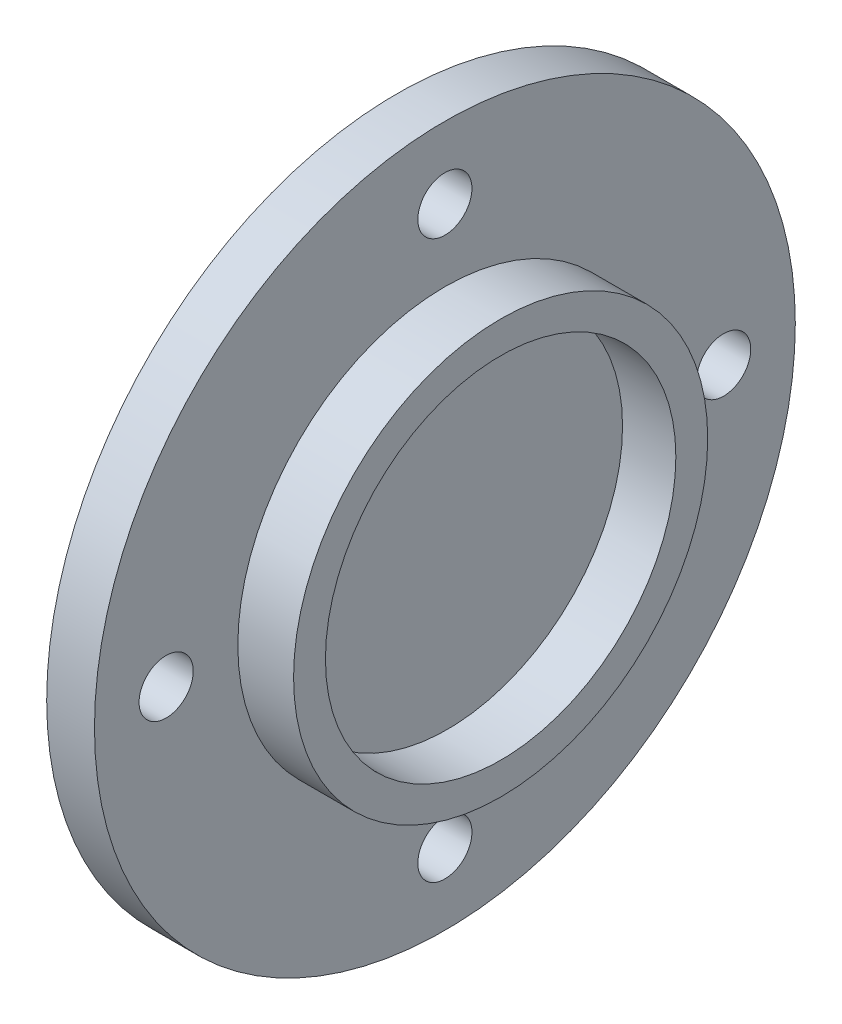
ISO-10303-21;
HEADER;
FILE_DESCRIPTION(('STEP AP214'),'2;1');
FILE_NAME('part.step','',(''),(''),'','','');
FILE_SCHEMA(('AUTOMOTIVE_DESIGN { 1 0 10303 214 1 1 1 1 }'));
ENDSEC;
DATA;
#1=APPLICATION_CONTEXT('core data for automotive mechanical design processes');
#2=APPLICATION_PROTOCOL_DEFINITION('international standard','automotive_design',2000,#1);
#3=PRODUCT_CONTEXT('',#1,'mechanical');
#4=PRODUCT('Part','Part','',(#3));
#5=PRODUCT_RELATED_PRODUCT_CATEGORY('part','',(#4));
#6=PRODUCT_DEFINITION_FORMATION('','',#4);
#7=PRODUCT_DEFINITION_CONTEXT('part definition',#1,'design');
#8=PRODUCT_DEFINITION('design','',#6,#7);
#9=PRODUCT_DEFINITION_SHAPE('','',#8);
#10=(LENGTH_UNIT() NAMED_UNIT(*) SI_UNIT(.MILLI.,.METRE.));
#11=(NAMED_UNIT(*) PLANE_ANGLE_UNIT() SI_UNIT($,.RADIAN.));
#12=(NAMED_UNIT(*) SI_UNIT($,.STERADIAN.) SOLID_ANGLE_UNIT());
#13=UNCERTAINTY_MEASURE_WITH_UNIT(LENGTH_MEASURE(1.E-05),#10,'distance_accuracy_value','');
#14=(GEOMETRIC_REPRESENTATION_CONTEXT(3) GLOBAL_UNCERTAINTY_ASSIGNED_CONTEXT((#13)) GLOBAL_UNIT_ASSIGNED_CONTEXT((#10,
#11,#12)) REPRESENTATION_CONTEXT('',''));
#15=CARTESIAN_POINT('',(0.,0.,0.));
#16=DIRECTION('',(0.,0.,1.));
#17=DIRECTION('',(1.,0.,0.));
#18=AXIS2_PLACEMENT_3D('',#15,#16,#17);
#19=CARTESIAN_POINT('',(-13.,0.,0.));
#20=DIRECTION('',(1.,0.,0.));
#21=DIRECTION('',(0.,0.,-1.));
#22=AXIS2_PLACEMENT_3D('',#19,#20,#21);
#23=PLANE('',#22);
#24=CARTESIAN_POINT('',(-13.,0.,-35.));
#25=DIRECTION('',(-1.,0.,0.));
#26=DIRECTION('',(0.,0.,1.));
#27=AXIS2_PLACEMENT_3D('',#24,#25,#26);
#28=CIRCLE('',#27,3.39999999999999);
#29=CARTESIAN_POINT('',(-13.,0.,-31.6));
#30=VERTEX_POINT('',#29);
#31=EDGE_CURVE('E139',#30,#30,#28,.T.);
#32=ORIENTED_EDGE('',*,*,#31,.F.);
#33=EDGE_LOOP('',(#32));
#34=FACE_BOUND('',#33,.T.);
#35=CARTESIAN_POINT('',(-13.,-35.,0.));
#36=DIRECTION('',(-1.,0.,0.));
#37=DIRECTION('',(0.,0.,1.));
#38=AXIS2_PLACEMENT_3D('',#35,#36,#37);
#39=CIRCLE('',#38,3.39999999999999);
#40=CARTESIAN_POINT('',(-13.,-35.,3.39999999999999));
#41=VERTEX_POINT('',#40);
#42=EDGE_CURVE('E81',#41,#41,#39,.T.);
#43=ORIENTED_EDGE('',*,*,#42,.F.);
#44=EDGE_LOOP('',(#43));
#45=FACE_BOUND('',#44,.T.);
#46=CARTESIAN_POINT('',(-13.,0.,35.));
#47=DIRECTION('',(-1.,0.,0.));
#48=DIRECTION('',(0.,0.,1.));
#49=AXIS2_PLACEMENT_3D('',#46,#47,#48);
#50=CIRCLE('',#49,3.39999999999999);
#51=CARTESIAN_POINT('',(-13.,0.,38.4));
#52=VERTEX_POINT('',#51);
#53=EDGE_CURVE('E67',#52,#52,#50,.T.);
#54=ORIENTED_EDGE('',*,*,#53,.F.);
#55=EDGE_LOOP('',(#54));
#56=FACE_BOUND('',#55,.T.);
#57=CARTESIAN_POINT('',(-13.,0.,0.));
#58=DIRECTION('',(-1.,0.,0.));
#59=DIRECTION('',(0.,0.,1.));
#60=AXIS2_PLACEMENT_3D('',#57,#58,#59);
#61=CIRCLE('',#60,44.);
#62=CARTESIAN_POINT('',(-13.,0.,44.));
#63=VERTEX_POINT('',#62);
#64=EDGE_CURVE('E10',#63,#63,#61,.T.);
#65=ORIENTED_EDGE('',*,*,#64,.T.);
#66=EDGE_LOOP('',(#65));
#67=FACE_BOUND('',#66,.T.);
#68=CARTESIAN_POINT('',(-13.,35.,0.));
#69=DIRECTION('',(-1.,0.,0.));
#70=DIRECTION('',(0.,0.,1.));
#71=AXIS2_PLACEMENT_3D('',#68,#69,#70);
#72=CIRCLE('',#71,3.39999999999999);
#73=CARTESIAN_POINT('',(-13.,35.,3.39999999999999));
#74=VERTEX_POINT('',#73);
#75=EDGE_CURVE('E63',#74,#74,#72,.T.);
#76=ORIENTED_EDGE('',*,*,#75,.F.);
#77=EDGE_LOOP('',(#76));
#78=FACE_BOUND('',#77,.T.);
#79=ADVANCED_FACE('F41',(#34,#45,#56,#67,#78),#23,.F.);
#80=CARTESIAN_POINT('',(-37.1538461538461,0.,0.));
#81=DIRECTION('',(-1.,0.,0.));
#82=DIRECTION('',(0.,0.,1.));
#83=AXIS2_PLACEMENT_3D('',#80,#81,#82);
#84=CYLINDRICAL_SURFACE('',#83,44.);
#85=ORIENTED_EDGE('',*,*,#64,.F.);
#86=EDGE_LOOP('',(#85));
#87=FACE_BOUND('',#86,.T.);
#88=CARTESIAN_POINT('',(-7.,0.,0.));
#89=DIRECTION('',(-1.,0.,0.));
#90=DIRECTION('',(0.,0.,1.));
#91=AXIS2_PLACEMENT_3D('',#88,#89,#90);
#92=CIRCLE('',#91,44.);
#93=CARTESIAN_POINT('',(-7.,0.,44.));
#94=VERTEX_POINT('',#93);
#95=EDGE_CURVE('E49',#94,#94,#92,.T.);
#96=ORIENTED_EDGE('',*,*,#95,.T.);
#97=EDGE_LOOP('',(#96));
#98=FACE_BOUND('',#97,.T.);
#99=ADVANCED_FACE('F130',(#87,#98),#84,.T.);
#100=CARTESIAN_POINT('',(-7.,44.,0.));
#101=DIRECTION('',(-1.,0.,0.));
#102=DIRECTION('',(0.,0.,1.));
#103=AXIS2_PLACEMENT_3D('',#100,#101,#102);
#104=PLANE('',#103);
#105=CARTESIAN_POINT('',(-7.,0.,-35.));
#106=DIRECTION('',(-1.,0.,0.));
#107=DIRECTION('',(0.,0.,1.));
#108=AXIS2_PLACEMENT_3D('',#105,#106,#107);
#109=CIRCLE('',#108,3.39999999999999);
#110=CARTESIAN_POINT('',(-7.,0.,-31.6));
#111=VERTEX_POINT('',#110);
#112=EDGE_CURVE('E44',#111,#111,#109,.T.);
#113=ORIENTED_EDGE('',*,*,#112,.T.);
#114=EDGE_LOOP('',(#113));
#115=FACE_BOUND('',#114,.T.);
#116=CARTESIAN_POINT('',(-7.,-35.,0.));
#117=DIRECTION('',(-1.,0.,0.));
#118=DIRECTION('',(0.,0.,1.));
#119=AXIS2_PLACEMENT_3D('',#116,#117,#118);
#120=CIRCLE('',#119,3.39999999999999);
#121=CARTESIAN_POINT('',(-7.,-35.,3.39999999999999));
#122=VERTEX_POINT('',#121);
#123=EDGE_CURVE('E75',#122,#122,#120,.T.);
#124=ORIENTED_EDGE('',*,*,#123,.T.);
#125=EDGE_LOOP('',(#124));
#126=FACE_BOUND('',#125,.T.);
#127=CARTESIAN_POINT('',(-7.,0.,35.));
#128=DIRECTION('',(-1.,0.,0.));
#129=DIRECTION('',(0.,0.,1.));
#130=AXIS2_PLACEMENT_3D('',#127,#128,#129);
#131=CIRCLE('',#130,3.39999999999999);
#132=CARTESIAN_POINT('',(-7.,0.,38.4));
#133=VERTEX_POINT('',#132);
#134=EDGE_CURVE('E64',#133,#133,#131,.T.);
#135=ORIENTED_EDGE('',*,*,#134,.T.);
#136=EDGE_LOOP('',(#135));
#137=FACE_BOUND('',#136,.T.);
#138=CARTESIAN_POINT('',(-7.,35.,0.));
#139=DIRECTION('',(-1.,0.,0.));
#140=DIRECTION('',(0.,0.,1.));
#141=AXIS2_PLACEMENT_3D('',#138,#139,#140);
#142=CIRCLE('',#141,3.39999999999999);
#143=CARTESIAN_POINT('',(-7.,35.,3.39999999999999));
#144=VERTEX_POINT('',#143);
#145=EDGE_CURVE('E59',#144,#144,#142,.T.);
#146=ORIENTED_EDGE('',*,*,#145,.T.);
#147=EDGE_LOOP('',(#146));
#148=FACE_BOUND('',#147,.T.);
#149=ORIENTED_EDGE('',*,*,#95,.F.);
#150=EDGE_LOOP('',(#149));
#151=FACE_BOUND('',#150,.T.);
#152=CARTESIAN_POINT('',(-7.,0.,0.));
#153=DIRECTION('',(-1.,0.,0.));
#154=DIRECTION('',(0.,0.,1.));
#155=AXIS2_PLACEMENT_3D('',#152,#153,#154);
#156=CIRCLE('',#155,26.);
#157=CARTESIAN_POINT('',(-7.,0.,26.));
#158=VERTEX_POINT('',#157);
#159=EDGE_CURVE('E55',#158,#158,#156,.T.);
#160=ORIENTED_EDGE('',*,*,#159,.T.);
#161=EDGE_LOOP('',(#160));
#162=FACE_BOUND('',#161,.T.);
#163=ADVANCED_FACE('F99',(#115,#126,#137,#148,#151,#162),#104,.F.);
#164=CARTESIAN_POINT('',(-37.1538461538461,0.,0.));
#165=DIRECTION('',(-1.,0.,0.));
#166=DIRECTION('',(0.,0.,1.));
#167=AXIS2_PLACEMENT_3D('',#164,#165,#166);
#168=CYLINDRICAL_SURFACE('',#167,26.);
#169=ORIENTED_EDGE('',*,*,#159,.F.);
#170=EDGE_LOOP('',(#169));
#171=FACE_BOUND('',#170,.T.);
#172=CARTESIAN_POINT('',(0.,0.,0.));
#173=DIRECTION('',(-1.,0.,0.));
#174=DIRECTION('',(0.,0.,1.));
#175=AXIS2_PLACEMENT_3D('',#172,#173,#174);
#176=CIRCLE('',#175,26.);
#177=CARTESIAN_POINT('',(0.,0.,26.));
#178=VERTEX_POINT('',#177);
#179=EDGE_CURVE('E92',#178,#178,#176,.T.);
#180=ORIENTED_EDGE('',*,*,#179,.T.);
#181=EDGE_LOOP('',(#180));
#182=FACE_BOUND('',#181,.T.);
#183=ADVANCED_FACE('F101',(#171,#182),#168,.T.);
#184=CARTESIAN_POINT('',(0.,26.,0.));
#185=DIRECTION('',(-1.,0.,0.));
#186=DIRECTION('',(0.,0.,1.));
#187=AXIS2_PLACEMENT_3D('',#184,#185,#186);
#188=PLANE('',#187);
#189=ORIENTED_EDGE('',*,*,#179,.F.);
#190=EDGE_LOOP('',(#189));
#191=FACE_BOUND('',#190,.T.);
#192=CARTESIAN_POINT('',(0.,0.,0.));
#193=DIRECTION('',(-1.,0.,0.));
#194=DIRECTION('',(0.,0.,1.));
#195=AXIS2_PLACEMENT_3D('',#192,#193,#194);
#196=CIRCLE('',#195,22.);
#197=CARTESIAN_POINT('',(0.,0.,22.));
#198=VERTEX_POINT('',#197);
#199=EDGE_CURVE('E88',#198,#198,#196,.T.);
#200=ORIENTED_EDGE('',*,*,#199,.T.);
#201=EDGE_LOOP('',(#200));
#202=FACE_BOUND('',#201,.T.);
#203=ADVANCED_FACE('F104',(#191,#202),#188,.F.);
#204=CARTESIAN_POINT('',(-37.1538461538461,0.,0.));
#205=DIRECTION('',(-1.,0.,0.));
#206=DIRECTION('',(0.,0.,1.));
#207=AXIS2_PLACEMENT_3D('',#204,#205,#206);
#208=CYLINDRICAL_SURFACE('',#207,22.);
#209=ORIENTED_EDGE('',*,*,#199,.F.);
#210=EDGE_LOOP('',(#209));
#211=FACE_BOUND('',#210,.T.);
#212=CARTESIAN_POINT('',(-6.69230769230767,0.,0.));
#213=DIRECTION('',(-1.,0.,0.));
#214=DIRECTION('',(0.,0.,1.));
#215=AXIS2_PLACEMENT_3D('',#212,#213,#214);
#216=CIRCLE('',#215,22.);
#217=CARTESIAN_POINT('',(-6.69230769230767,0.,22.));
#218=VERTEX_POINT('',#217);
#219=EDGE_CURVE('E62',#218,#218,#216,.T.);
#220=ORIENTED_EDGE('',*,*,#219,.T.);
#221=EDGE_LOOP('',(#220));
#222=FACE_BOUND('',#221,.T.);
#223=ADVANCED_FACE('F110',(#211,#222),#208,.F.);
#224=CARTESIAN_POINT('',(-6.69230769230767,22.,0.));
#225=DIRECTION('',(-1.,0.,0.));
#226=DIRECTION('',(0.,0.,1.));
#227=AXIS2_PLACEMENT_3D('',#224,#225,#226);
#228=PLANE('',#227);
#229=ORIENTED_EDGE('',*,*,#219,.F.);
#230=EDGE_LOOP('',(#229));
#231=FACE_BOUND('',#230,.T.);
#232=ADVANCED_FACE('F116',(#231),#228,.F.);
#233=CARTESIAN_POINT('',(-13.,35.,0.));
#234=DIRECTION('',(-1.,0.,0.));
#235=DIRECTION('',(0.,0.,1.));
#236=AXIS2_PLACEMENT_3D('',#233,#234,#235);
#237=CYLINDRICAL_SURFACE('',#236,3.39999999999999);
#238=ORIENTED_EDGE('',*,*,#75,.T.);
#239=EDGE_LOOP('',(#238));
#240=FACE_BOUND('',#239,.T.);
#241=ORIENTED_EDGE('',*,*,#145,.F.);
#242=EDGE_LOOP('',(#241));
#243=FACE_BOUND('',#242,.T.);
#244=ADVANCED_FACE('F121',(#240,#243),#237,.F.);
#245=CARTESIAN_POINT('',(-13.,0.,35.));
#246=DIRECTION('',(-1.,0.,0.));
#247=DIRECTION('',(0.,0.,1.));
#248=AXIS2_PLACEMENT_3D('',#245,#246,#247);
#249=CYLINDRICAL_SURFACE('',#248,3.39999999999999);
#250=ORIENTED_EDGE('',*,*,#53,.T.);
#251=EDGE_LOOP('',(#250));
#252=FACE_BOUND('',#251,.T.);
#253=ORIENTED_EDGE('',*,*,#134,.F.);
#254=EDGE_LOOP('',(#253));
#255=FACE_BOUND('',#254,.T.);
#256=ADVANCED_FACE('F126',(#252,#255),#249,.F.);
#257=CARTESIAN_POINT('',(-13.,-35.,0.));
#258=DIRECTION('',(-1.,0.,0.));
#259=DIRECTION('',(0.,0.,1.));
#260=AXIS2_PLACEMENT_3D('',#257,#258,#259);
#261=CYLINDRICAL_SURFACE('',#260,3.39999999999999);
#262=ORIENTED_EDGE('',*,*,#42,.T.);
#263=EDGE_LOOP('',(#262));
#264=FACE_BOUND('',#263,.T.);
#265=ORIENTED_EDGE('',*,*,#123,.F.);
#266=EDGE_LOOP('',(#265));
#267=FACE_BOUND('',#266,.T.);
#268=ADVANCED_FACE('F161',(#264,#267),#261,.F.);
#269=CARTESIAN_POINT('',(-13.,0.,-35.));
#270=DIRECTION('',(-1.,0.,0.));
#271=DIRECTION('',(0.,0.,1.));
#272=AXIS2_PLACEMENT_3D('',#269,#270,#271);
#273=CYLINDRICAL_SURFACE('',#272,3.39999999999999);
#274=ORIENTED_EDGE('',*,*,#31,.T.);
#275=EDGE_LOOP('',(#274));
#276=FACE_BOUND('',#275,.T.);
#277=ORIENTED_EDGE('',*,*,#112,.F.);
#278=EDGE_LOOP('',(#277));
#279=FACE_BOUND('',#278,.T.);
#280=ADVANCED_FACE('F163',(#276,#279),#273,.F.);
#281=CLOSED_SHELL('',(#79,#99,#163,#183,#203,#223,#232,#244,#256,#268,#280));
#282=MANIFOLD_SOLID_BREP('B2',#281);
#283=ADVANCED_BREP_SHAPE_REPRESENTATION('',(#18,#282),#14);
#284=SHAPE_DEFINITION_REPRESENTATION(#9,#283);
ENDSEC;
END-ISO-10303-21;
